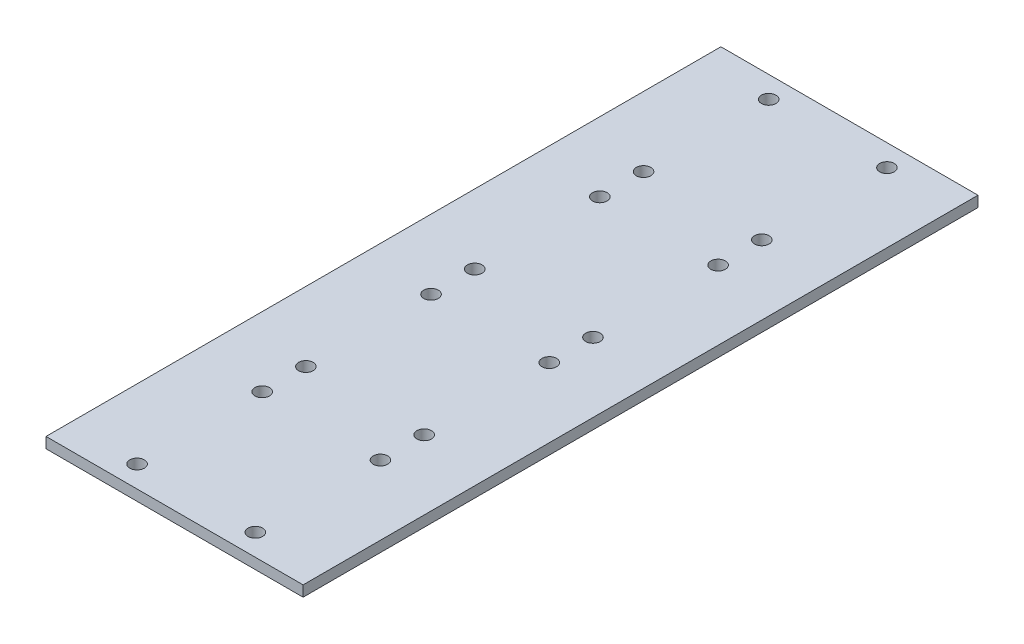
ISO-10303-21;
HEADER;
FILE_DESCRIPTION(('STEP AP214'),'2;1');
FILE_NAME('part.step','',(''),(''),'','','');
FILE_SCHEMA(('AUTOMOTIVE_DESIGN { 1 0 10303 214 1 1 1 1 }'));
ENDSEC;
DATA;
#1=APPLICATION_CONTEXT('core data for automotive mechanical design processes');
#2=APPLICATION_PROTOCOL_DEFINITION('international standard','automotive_design',2000,#1);
#3=PRODUCT_CONTEXT('',#1,'mechanical');
#4=PRODUCT('Part','Part','',(#3));
#5=PRODUCT_RELATED_PRODUCT_CATEGORY('part','',(#4));
#6=PRODUCT_DEFINITION_FORMATION('','',#4);
#7=PRODUCT_DEFINITION_CONTEXT('part definition',#1,'design');
#8=PRODUCT_DEFINITION('design','',#6,#7);
#9=PRODUCT_DEFINITION_SHAPE('','',#8);
#10=(LENGTH_UNIT() NAMED_UNIT(*) SI_UNIT(.MILLI.,.METRE.));
#11=(NAMED_UNIT(*) PLANE_ANGLE_UNIT() SI_UNIT($,.RADIAN.));
#12=(NAMED_UNIT(*) SI_UNIT($,.STERADIAN.) SOLID_ANGLE_UNIT());
#13=UNCERTAINTY_MEASURE_WITH_UNIT(LENGTH_MEASURE(1.E-05),#10,'distance_accuracy_value','');
#14=(GEOMETRIC_REPRESENTATION_CONTEXT(3) GLOBAL_UNCERTAINTY_ASSIGNED_CONTEXT((#13)) GLOBAL_UNIT_ASSIGNED_CONTEXT((#10,
#11,#12)) REPRESENTATION_CONTEXT('',''));
#15=CARTESIAN_POINT('',(0.,0.,0.));
#16=DIRECTION('',(0.,0.,1.));
#17=DIRECTION('',(1.,0.,0.));
#18=AXIS2_PLACEMENT_3D('',#15,#16,#17);
#19=CARTESIAN_POINT('',(0.,3.175,0.));
#20=DIRECTION('',(0.,1.,0.));
#21=DIRECTION('',(0.,0.,1.));
#22=AXIS2_PLACEMENT_3D('',#19,#20,#21);
#23=PLANE('',#22);
#24=CARTESIAN_POINT('',(0.,3.175,-113.03));
#25=DIRECTION('',(0.,1.,0.));
#26=DIRECTION('',(0.,0.,1.));
#27=AXIS2_PLACEMENT_3D('',#24,#25,#26);
#28=CIRCLE('',#27,2.159);
#29=CARTESIAN_POINT('',(0.,3.175,-110.871));
#30=VERTEX_POINT('',#29);
#31=EDGE_CURVE('E196',#30,#30,#28,.T.);
#32=ORIENTED_EDGE('',*,*,#31,.F.);
#33=EDGE_LOOP('',(#32));
#34=FACE_BOUND('',#33,.T.);
#35=CARTESIAN_POINT('',(0.,3.175,-150.114));
#36=DIRECTION('',(0.,1.,0.));
#37=DIRECTION('',(0.,0.,1.));
#38=AXIS2_PLACEMENT_3D('',#35,#36,#37);
#39=CIRCLE('',#38,2.15899999999999);
#40=CARTESIAN_POINT('',(0.,3.175,-147.955));
#41=VERTEX_POINT('',#40);
#42=EDGE_CURVE('E184',#41,#41,#39,.T.);
#43=ORIENTED_EDGE('',*,*,#42,.F.);
#44=EDGE_LOOP('',(#43));
#45=FACE_BOUND('',#44,.T.);
#46=CARTESIAN_POINT('',(0.,3.175,-62.992));
#47=DIRECTION('',(0.,1.,0.));
#48=DIRECTION('',(0.,0.,1.));
#49=AXIS2_PLACEMENT_3D('',#46,#47,#48);
#50=CIRCLE('',#49,2.159);
#51=CARTESIAN_POINT('',(0.,3.175,-60.833));
#52=VERTEX_POINT('',#51);
#53=EDGE_CURVE('E172',#52,#52,#50,.T.);
#54=ORIENTED_EDGE('',*,*,#53,.F.);
#55=EDGE_LOOP('',(#54));
#56=FACE_BOUND('',#55,.T.);
#57=CARTESIAN_POINT('',(0.,3.175,-100.076));
#58=DIRECTION('',(0.,1.,0.));
#59=DIRECTION('',(0.,0.,1.));
#60=AXIS2_PLACEMENT_3D('',#57,#58,#59);
#61=CIRCLE('',#60,2.159);
#62=CARTESIAN_POINT('',(0.,3.175,-97.917));
#63=VERTEX_POINT('',#62);
#64=EDGE_CURVE('E160',#63,#63,#61,.T.);
#65=ORIENTED_EDGE('',*,*,#64,.F.);
#66=EDGE_LOOP('',(#65));
#67=FACE_BOUND('',#66,.T.);
#68=CARTESIAN_POINT('',(0.,3.175,-12.954));
#69=DIRECTION('',(0.,1.,0.));
#70=DIRECTION('',(0.,0.,1.));
#71=AXIS2_PLACEMENT_3D('',#68,#69,#70);
#72=CIRCLE('',#71,2.15899999999992);
#73=CARTESIAN_POINT('',(0.,3.175,-10.7950000000001));
#74=VERTEX_POINT('',#73);
#75=EDGE_CURVE('E148',#74,#74,#72,.T.);
#76=ORIENTED_EDGE('',*,*,#75,.F.);
#77=EDGE_LOOP('',(#76));
#78=FACE_BOUND('',#77,.T.);
#79=CARTESIAN_POINT('',(0.,3.175,-50.038));
#80=DIRECTION('',(0.,1.,0.));
#81=DIRECTION('',(0.,0.,1.));
#82=AXIS2_PLACEMENT_3D('',#79,#80,#81);
#83=CIRCLE('',#82,2.159);
#84=CARTESIAN_POINT('',(0.,3.175,-47.879));
#85=VERTEX_POINT('',#84);
#86=EDGE_CURVE('E136',#85,#85,#83,.T.);
#87=ORIENTED_EDGE('',*,*,#86,.F.);
#88=EDGE_LOOP('',(#87));
#89=FACE_BOUND('',#88,.T.);
#90=CARTESIAN_POINT('',(0.,3.175,37.084));
#91=DIRECTION('',(0.,1.,0.));
#92=DIRECTION('',(0.,0.,1.));
#93=AXIS2_PLACEMENT_3D('',#90,#91,#92);
#94=CIRCLE('',#93,2.159);
#95=CARTESIAN_POINT('',(0.,3.175,39.243));
#96=VERTEX_POINT('',#95);
#97=EDGE_CURVE('E124',#96,#96,#94,.T.);
#98=ORIENTED_EDGE('',*,*,#97,.F.);
#99=EDGE_LOOP('',(#98));
#100=FACE_BOUND('',#99,.T.);
#101=CARTESIAN_POINT('',(0.,3.175,0.));
#102=DIRECTION('',(0.,1.,0.));
#103=DIRECTION('',(0.,0.,1.));
#104=AXIS2_PLACEMENT_3D('',#101,#102,#103);
#105=CIRCLE('',#104,2.159);
#106=CARTESIAN_POINT('',(0.,3.175,2.159));
#107=VERTEX_POINT('',#106);
#108=EDGE_CURVE('E103',#107,#107,#105,.T.);
#109=ORIENTED_EDGE('',*,*,#108,.F.);
#110=EDGE_LOOP('',(#109));
#111=FACE_BOUND('',#110,.T.);
#112=DIRECTION('',(0.,0.,1.));
#113=VECTOR('',#112,1.);
#114=CARTESIAN_POINT('',(-20.574,3.175,-156.5275));
#115=LINE('',#114,#113);
#116=CARTESIAN_POINT('',(-20.574,3.175,-156.5275));
#117=VERTEX_POINT('',#116);
#118=CARTESIAN_POINT('',(-20.574,3.175,43.4975));
#119=VERTEX_POINT('',#118);
#120=EDGE_CURVE('E88',#117,#119,#115,.T.);
#121=ORIENTED_EDGE('',*,*,#120,.T.);
#122=DIRECTION('',(1.,0.,0.));
#123=VECTOR('',#122,1.);
#124=CARTESIAN_POINT('',(-20.574,3.175,43.4975));
#125=LINE('',#124,#123);
#126=CARTESIAN_POINT('',(55.626,3.175,43.4975));
#127=VERTEX_POINT('',#126);
#128=EDGE_CURVE('E83',#119,#127,#125,.T.);
#129=ORIENTED_EDGE('',*,*,#128,.T.);
#130=DIRECTION('',(0.,0.,-1.));
#131=VECTOR('',#130,1.);
#132=CARTESIAN_POINT('',(55.626,3.175,-156.5275));
#133=LINE('',#132,#131);
#134=CARTESIAN_POINT('',(55.626,3.175,-156.5275));
#135=VERTEX_POINT('',#134);
#136=EDGE_CURVE('E86',#127,#135,#133,.T.);
#137=ORIENTED_EDGE('',*,*,#136,.T.);
#138=DIRECTION('',(-1.,0.,0.));
#139=VECTOR('',#138,1.);
#140=CARTESIAN_POINT('',(-20.574,3.175,-156.5275));
#141=LINE('',#140,#139);
#142=EDGE_CURVE('E53',#135,#117,#141,.T.);
#143=ORIENTED_EDGE('',*,*,#142,.T.);
#144=EDGE_LOOP('',(#121,#129,#137,#143));
#145=FACE_BOUND('',#144,.T.);
#146=CARTESIAN_POINT('',(35.052,3.175,0.));
#147=DIRECTION('',(0.,1.,0.));
#148=DIRECTION('',(0.,0.,1.));
#149=AXIS2_PLACEMENT_3D('',#146,#147,#148);
#150=CIRCLE('',#149,2.159);
#151=CARTESIAN_POINT('',(35.052,3.175,2.159));
#152=VERTEX_POINT('',#151);
#153=EDGE_CURVE('E118',#152,#152,#150,.T.);
#154=ORIENTED_EDGE('',*,*,#153,.F.);
#155=EDGE_LOOP('',(#154));
#156=FACE_BOUND('',#155,.T.);
#157=CARTESIAN_POINT('',(35.052,3.175,37.084));
#158=DIRECTION('',(0.,1.,0.));
#159=DIRECTION('',(0.,0.,1.));
#160=AXIS2_PLACEMENT_3D('',#157,#158,#159);
#161=CIRCLE('',#160,2.159);
#162=CARTESIAN_POINT('',(35.052,3.175,39.243));
#163=VERTEX_POINT('',#162);
#164=EDGE_CURVE('E130',#163,#163,#161,.T.);
#165=ORIENTED_EDGE('',*,*,#164,.F.);
#166=EDGE_LOOP('',(#165));
#167=FACE_BOUND('',#166,.T.);
#168=CARTESIAN_POINT('',(35.052,3.175,-50.038));
#169=DIRECTION('',(0.,1.,0.));
#170=DIRECTION('',(0.,0.,1.));
#171=AXIS2_PLACEMENT_3D('',#168,#169,#170);
#172=CIRCLE('',#171,2.159);
#173=CARTESIAN_POINT('',(35.052,3.175,-47.879));
#174=VERTEX_POINT('',#173);
#175=EDGE_CURVE('E142',#174,#174,#172,.T.);
#176=ORIENTED_EDGE('',*,*,#175,.F.);
#177=EDGE_LOOP('',(#176));
#178=FACE_BOUND('',#177,.T.);
#179=CARTESIAN_POINT('',(35.052,3.175,-12.954));
#180=DIRECTION('',(0.,1.,0.));
#181=DIRECTION('',(0.,0.,1.));
#182=AXIS2_PLACEMENT_3D('',#179,#180,#181);
#183=CIRCLE('',#182,2.15899999999998);
#184=CARTESIAN_POINT('',(35.052,3.175,-10.795));
#185=VERTEX_POINT('',#184);
#186=EDGE_CURVE('E154',#185,#185,#183,.T.);
#187=ORIENTED_EDGE('',*,*,#186,.F.);
#188=EDGE_LOOP('',(#187));
#189=FACE_BOUND('',#188,.T.);
#190=CARTESIAN_POINT('',(35.052,3.175,-100.076));
#191=DIRECTION('',(0.,1.,0.));
#192=DIRECTION('',(0.,0.,1.));
#193=AXIS2_PLACEMENT_3D('',#190,#191,#192);
#194=CIRCLE('',#193,2.15900000000001);
#195=CARTESIAN_POINT('',(35.052,3.175,-97.917));
#196=VERTEX_POINT('',#195);
#197=EDGE_CURVE('E166',#196,#196,#194,.T.);
#198=ORIENTED_EDGE('',*,*,#197,.F.);
#199=EDGE_LOOP('',(#198));
#200=FACE_BOUND('',#199,.T.);
#201=CARTESIAN_POINT('',(35.052,3.175,-62.992));
#202=DIRECTION('',(0.,1.,0.));
#203=DIRECTION('',(0.,0.,1.));
#204=AXIS2_PLACEMENT_3D('',#201,#202,#203);
#205=CIRCLE('',#204,2.15900000000001);
#206=CARTESIAN_POINT('',(35.052,3.175,-60.833));
#207=VERTEX_POINT('',#206);
#208=EDGE_CURVE('E178',#207,#207,#205,.T.);
#209=ORIENTED_EDGE('',*,*,#208,.F.);
#210=EDGE_LOOP('',(#209));
#211=FACE_BOUND('',#210,.T.);
#212=CARTESIAN_POINT('',(35.052,3.175,-150.114));
#213=DIRECTION('',(0.,1.,0.));
#214=DIRECTION('',(0.,0.,1.));
#215=AXIS2_PLACEMENT_3D('',#212,#213,#214);
#216=CIRCLE('',#215,2.15899999999998);
#217=CARTESIAN_POINT('',(35.052,3.175,-147.955));
#218=VERTEX_POINT('',#217);
#219=EDGE_CURVE('E190',#218,#218,#216,.T.);
#220=ORIENTED_EDGE('',*,*,#219,.F.);
#221=EDGE_LOOP('',(#220));
#222=FACE_BOUND('',#221,.T.);
#223=CARTESIAN_POINT('',(35.052,3.175,-113.03));
#224=DIRECTION('',(0.,1.,0.));
#225=DIRECTION('',(0.,0.,1.));
#226=AXIS2_PLACEMENT_3D('',#223,#224,#225);
#227=CIRCLE('',#226,2.15899999999999);
#228=CARTESIAN_POINT('',(35.052,3.175,-110.871));
#229=VERTEX_POINT('',#228);
#230=EDGE_CURVE('E202',#229,#229,#227,.T.);
#231=ORIENTED_EDGE('',*,*,#230,.F.);
#232=EDGE_LOOP('',(#231));
#233=FACE_BOUND('',#232,.T.);
#234=ADVANCED_FACE('F36',(#34,#45,#56,#67,#78,#89,#100,#111,#145,#156,#167,#178,#189,#200,#211,
#222,#233),#23,.T.);
#235=CARTESIAN_POINT('',(0.,0.,0.));
#236=DIRECTION('',(0.,1.,0.));
#237=DIRECTION('',(0.,0.,1.));
#238=AXIS2_PLACEMENT_3D('',#235,#236,#237);
#239=PLANE('',#238);
#240=DIRECTION('',(0.,0.,1.));
#241=VECTOR('',#240,1.);
#242=CARTESIAN_POINT('',(-20.574,0.,-156.5275));
#243=LINE('',#242,#241);
#244=CARTESIAN_POINT('',(-20.574,0.,-156.5275));
#245=VERTEX_POINT('',#244);
#246=CARTESIAN_POINT('',(-20.574,0.,43.4975));
#247=VERTEX_POINT('',#246);
#248=EDGE_CURVE('E100',#245,#247,#243,.T.);
#249=ORIENTED_EDGE('',*,*,#248,.F.);
#250=DIRECTION('',(-1.,0.,0.));
#251=VECTOR('',#250,1.);
#252=CARTESIAN_POINT('',(-20.574,0.,-156.5275));
#253=LINE('',#252,#251);
#254=CARTESIAN_POINT('',(55.626,0.,-156.5275));
#255=VERTEX_POINT('',#254);
#256=EDGE_CURVE('E76',#255,#245,#253,.T.);
#257=ORIENTED_EDGE('',*,*,#256,.F.);
#258=DIRECTION('',(0.,0.,-1.));
#259=VECTOR('',#258,1.);
#260=CARTESIAN_POINT('',(55.626,0.,-156.5275));
#261=LINE('',#260,#259);
#262=CARTESIAN_POINT('',(55.626,0.,43.4975));
#263=VERTEX_POINT('',#262);
#264=EDGE_CURVE('E70',#263,#255,#261,.T.);
#265=ORIENTED_EDGE('',*,*,#264,.F.);
#266=DIRECTION('',(1.,0.,0.));
#267=VECTOR('',#266,1.);
#268=CARTESIAN_POINT('',(-20.574,0.,43.4975));
#269=LINE('',#268,#267);
#270=EDGE_CURVE('E92',#247,#263,#269,.T.);
#271=ORIENTED_EDGE('',*,*,#270,.F.);
#272=EDGE_LOOP('',(#249,#257,#265,#271));
#273=FACE_BOUND('',#272,.T.);
#274=CARTESIAN_POINT('',(0.,0.,0.));
#275=DIRECTION('',(0.,1.,0.));
#276=DIRECTION('',(0.,0.,1.));
#277=AXIS2_PLACEMENT_3D('',#274,#275,#276);
#278=CIRCLE('',#277,2.159);
#279=CARTESIAN_POINT('',(0.,0.,2.159));
#280=VERTEX_POINT('',#279);
#281=EDGE_CURVE('E115',#280,#280,#278,.T.);
#282=ORIENTED_EDGE('',*,*,#281,.T.);
#283=EDGE_LOOP('',(#282));
#284=FACE_BOUND('',#283,.T.);
#285=CARTESIAN_POINT('',(35.052,0.,0.));
#286=DIRECTION('',(0.,1.,0.));
#287=DIRECTION('',(0.,0.,1.));
#288=AXIS2_PLACEMENT_3D('',#285,#286,#287);
#289=CIRCLE('',#288,2.159);
#290=CARTESIAN_POINT('',(35.052,0.,2.159));
#291=VERTEX_POINT('',#290);
#292=EDGE_CURVE('E121',#291,#291,#289,.T.);
#293=ORIENTED_EDGE('',*,*,#292,.T.);
#294=EDGE_LOOP('',(#293));
#295=FACE_BOUND('',#294,.T.);
#296=CARTESIAN_POINT('',(0.,0.,37.084));
#297=DIRECTION('',(0.,1.,0.));
#298=DIRECTION('',(0.,0.,1.));
#299=AXIS2_PLACEMENT_3D('',#296,#297,#298);
#300=CIRCLE('',#299,2.159);
#301=CARTESIAN_POINT('',(0.,0.,39.243));
#302=VERTEX_POINT('',#301);
#303=EDGE_CURVE('E127',#302,#302,#300,.T.);
#304=ORIENTED_EDGE('',*,*,#303,.T.);
#305=EDGE_LOOP('',(#304));
#306=FACE_BOUND('',#305,.T.);
#307=CARTESIAN_POINT('',(35.052,0.,37.084));
#308=DIRECTION('',(0.,1.,0.));
#309=DIRECTION('',(0.,0.,1.));
#310=AXIS2_PLACEMENT_3D('',#307,#308,#309);
#311=CIRCLE('',#310,2.159);
#312=CARTESIAN_POINT('',(35.052,0.,39.243));
#313=VERTEX_POINT('',#312);
#314=EDGE_CURVE('E133',#313,#313,#311,.T.);
#315=ORIENTED_EDGE('',*,*,#314,.T.);
#316=EDGE_LOOP('',(#315));
#317=FACE_BOUND('',#316,.T.);
#318=CARTESIAN_POINT('',(0.,0.,-50.038));
#319=DIRECTION('',(0.,1.,0.));
#320=DIRECTION('',(0.,0.,1.));
#321=AXIS2_PLACEMENT_3D('',#318,#319,#320);
#322=CIRCLE('',#321,2.159);
#323=CARTESIAN_POINT('',(0.,0.,-47.879));
#324=VERTEX_POINT('',#323);
#325=EDGE_CURVE('E139',#324,#324,#322,.T.);
#326=ORIENTED_EDGE('',*,*,#325,.T.);
#327=EDGE_LOOP('',(#326));
#328=FACE_BOUND('',#327,.T.);
#329=CARTESIAN_POINT('',(35.052,0.,-50.038));
#330=DIRECTION('',(0.,1.,0.));
#331=DIRECTION('',(0.,0.,1.));
#332=AXIS2_PLACEMENT_3D('',#329,#330,#331);
#333=CIRCLE('',#332,2.159);
#334=CARTESIAN_POINT('',(35.052,0.,-47.879));
#335=VERTEX_POINT('',#334);
#336=EDGE_CURVE('E145',#335,#335,#333,.T.);
#337=ORIENTED_EDGE('',*,*,#336,.T.);
#338=EDGE_LOOP('',(#337));
#339=FACE_BOUND('',#338,.T.);
#340=CARTESIAN_POINT('',(0.,0.,-12.954));
#341=DIRECTION('',(0.,1.,0.));
#342=DIRECTION('',(0.,0.,1.));
#343=AXIS2_PLACEMENT_3D('',#340,#341,#342);
#344=CIRCLE('',#343,2.15899999999992);
#345=CARTESIAN_POINT('',(0.,0.,-10.7950000000001));
#346=VERTEX_POINT('',#345);
#347=EDGE_CURVE('E151',#346,#346,#344,.T.);
#348=ORIENTED_EDGE('',*,*,#347,.T.);
#349=EDGE_LOOP('',(#348));
#350=FACE_BOUND('',#349,.T.);
#351=CARTESIAN_POINT('',(35.052,0.,-12.954));
#352=DIRECTION('',(0.,1.,0.));
#353=DIRECTION('',(0.,0.,1.));
#354=AXIS2_PLACEMENT_3D('',#351,#352,#353);
#355=CIRCLE('',#354,2.15899999999998);
#356=CARTESIAN_POINT('',(35.052,0.,-10.795));
#357=VERTEX_POINT('',#356);
#358=EDGE_CURVE('E157',#357,#357,#355,.T.);
#359=ORIENTED_EDGE('',*,*,#358,.T.);
#360=EDGE_LOOP('',(#359));
#361=FACE_BOUND('',#360,.T.);
#362=CARTESIAN_POINT('',(0.,0.,-100.076));
#363=DIRECTION('',(0.,1.,0.));
#364=DIRECTION('',(0.,0.,1.));
#365=AXIS2_PLACEMENT_3D('',#362,#363,#364);
#366=CIRCLE('',#365,2.159);
#367=CARTESIAN_POINT('',(0.,0.,-97.917));
#368=VERTEX_POINT('',#367);
#369=EDGE_CURVE('E163',#368,#368,#366,.T.);
#370=ORIENTED_EDGE('',*,*,#369,.T.);
#371=EDGE_LOOP('',(#370));
#372=FACE_BOUND('',#371,.T.);
#373=CARTESIAN_POINT('',(35.052,0.,-100.076));
#374=DIRECTION('',(0.,1.,0.));
#375=DIRECTION('',(0.,0.,1.));
#376=AXIS2_PLACEMENT_3D('',#373,#374,#375);
#377=CIRCLE('',#376,2.15900000000001);
#378=CARTESIAN_POINT('',(35.052,0.,-97.917));
#379=VERTEX_POINT('',#378);
#380=EDGE_CURVE('E169',#379,#379,#377,.T.);
#381=ORIENTED_EDGE('',*,*,#380,.T.);
#382=EDGE_LOOP('',(#381));
#383=FACE_BOUND('',#382,.T.);
#384=CARTESIAN_POINT('',(0.,0.,-62.992));
#385=DIRECTION('',(0.,1.,0.));
#386=DIRECTION('',(0.,0.,1.));
#387=AXIS2_PLACEMENT_3D('',#384,#385,#386);
#388=CIRCLE('',#387,2.159);
#389=CARTESIAN_POINT('',(0.,0.,-60.833));
#390=VERTEX_POINT('',#389);
#391=EDGE_CURVE('E175',#390,#390,#388,.T.);
#392=ORIENTED_EDGE('',*,*,#391,.T.);
#393=EDGE_LOOP('',(#392));
#394=FACE_BOUND('',#393,.T.);
#395=CARTESIAN_POINT('',(35.052,0.,-62.992));
#396=DIRECTION('',(0.,1.,0.));
#397=DIRECTION('',(0.,0.,1.));
#398=AXIS2_PLACEMENT_3D('',#395,#396,#397);
#399=CIRCLE('',#398,2.15900000000001);
#400=CARTESIAN_POINT('',(35.052,0.,-60.833));
#401=VERTEX_POINT('',#400);
#402=EDGE_CURVE('E181',#401,#401,#399,.T.);
#403=ORIENTED_EDGE('',*,*,#402,.T.);
#404=EDGE_LOOP('',(#403));
#405=FACE_BOUND('',#404,.T.);
#406=CARTESIAN_POINT('',(0.,0.,-150.114));
#407=DIRECTION('',(0.,1.,0.));
#408=DIRECTION('',(0.,0.,1.));
#409=AXIS2_PLACEMENT_3D('',#406,#407,#408);
#410=CIRCLE('',#409,2.15899999999999);
#411=CARTESIAN_POINT('',(0.,0.,-147.955));
#412=VERTEX_POINT('',#411);
#413=EDGE_CURVE('E187',#412,#412,#410,.T.);
#414=ORIENTED_EDGE('',*,*,#413,.T.);
#415=EDGE_LOOP('',(#414));
#416=FACE_BOUND('',#415,.T.);
#417=CARTESIAN_POINT('',(35.052,0.,-150.114));
#418=DIRECTION('',(0.,1.,0.));
#419=DIRECTION('',(0.,0.,1.));
#420=AXIS2_PLACEMENT_3D('',#417,#418,#419);
#421=CIRCLE('',#420,2.15899999999998);
#422=CARTESIAN_POINT('',(35.052,0.,-147.955));
#423=VERTEX_POINT('',#422);
#424=EDGE_CURVE('E193',#423,#423,#421,.T.);
#425=ORIENTED_EDGE('',*,*,#424,.T.);
#426=EDGE_LOOP('',(#425));
#427=FACE_BOUND('',#426,.T.);
#428=CARTESIAN_POINT('',(0.,0.,-113.03));
#429=DIRECTION('',(0.,1.,0.));
#430=DIRECTION('',(0.,0.,1.));
#431=AXIS2_PLACEMENT_3D('',#428,#429,#430);
#432=CIRCLE('',#431,2.159);
#433=CARTESIAN_POINT('',(0.,0.,-110.871));
#434=VERTEX_POINT('',#433);
#435=EDGE_CURVE('E199',#434,#434,#432,.T.);
#436=ORIENTED_EDGE('',*,*,#435,.T.);
#437=EDGE_LOOP('',(#436));
#438=FACE_BOUND('',#437,.T.);
#439=CARTESIAN_POINT('',(35.052,0.,-113.03));
#440=DIRECTION('',(0.,1.,0.));
#441=DIRECTION('',(0.,0.,1.));
#442=AXIS2_PLACEMENT_3D('',#439,#440,#441);
#443=CIRCLE('',#442,2.15899999999999);
#444=CARTESIAN_POINT('',(35.052,0.,-110.871));
#445=VERTEX_POINT('',#444);
#446=EDGE_CURVE('E205',#445,#445,#443,.T.);
#447=ORIENTED_EDGE('',*,*,#446,.T.);
#448=EDGE_LOOP('',(#447));
#449=FACE_BOUND('',#448,.T.);
#450=ADVANCED_FACE('F111',(#273,#284,#295,#306,#317,#328,#339,#350,#361,#372,#383,#394,#405,
#416,#427,#438,#449),#239,.F.);
#451=CARTESIAN_POINT('',(-20.574,3.175,-156.5275));
#452=DIRECTION('',(1.,0.,0.));
#453=DIRECTION('',(0.,0.,-1.));
#454=AXIS2_PLACEMENT_3D('',#451,#452,#453);
#455=PLANE('',#454);
#456=ORIENTED_EDGE('',*,*,#248,.T.);
#457=DIRECTION('',(0.,-1.,0.));
#458=VECTOR('',#457,1.);
#459=CARTESIAN_POINT('',(-20.574,3.175,43.4975));
#460=LINE('',#459,#458);
#461=EDGE_CURVE('E11',#119,#247,#460,.T.);
#462=ORIENTED_EDGE('',*,*,#461,.F.);
#463=ORIENTED_EDGE('',*,*,#120,.F.);
#464=DIRECTION('',(0.,-1.,0.));
#465=VECTOR('',#464,1.);
#466=CARTESIAN_POINT('',(-20.574,3.175,-156.5275));
#467=LINE('',#466,#465);
#468=EDGE_CURVE('E96',#117,#245,#467,.T.);
#469=ORIENTED_EDGE('',*,*,#468,.T.);
#470=EDGE_LOOP('',(#456,#462,#463,#469));
#471=FACE_BOUND('',#470,.T.);
#472=ADVANCED_FACE('F38',(#471),#455,.F.);
#473=CARTESIAN_POINT('',(-20.574,3.175,43.4975));
#474=DIRECTION('',(0.,0.,-1.));
#475=DIRECTION('',(-1.,0.,0.));
#476=AXIS2_PLACEMENT_3D('',#473,#474,#475);
#477=PLANE('',#476);
#478=ORIENTED_EDGE('',*,*,#270,.T.);
#479=DIRECTION('',(0.,-1.,0.));
#480=VECTOR('',#479,1.);
#481=CARTESIAN_POINT('',(55.626,3.175,43.4975));
#482=LINE('',#481,#480);
#483=EDGE_CURVE('E45',#127,#263,#482,.T.);
#484=ORIENTED_EDGE('',*,*,#483,.F.);
#485=ORIENTED_EDGE('',*,*,#128,.F.);
#486=ORIENTED_EDGE('',*,*,#461,.T.);
#487=EDGE_LOOP('',(#478,#484,#485,#486));
#488=FACE_BOUND('',#487,.T.);
#489=ADVANCED_FACE('F91',(#488),#477,.F.);
#490=CARTESIAN_POINT('',(55.626,3.175,-156.5275));
#491=DIRECTION('',(-1.,0.,0.));
#492=DIRECTION('',(0.,0.,1.));
#493=AXIS2_PLACEMENT_3D('',#490,#491,#492);
#494=PLANE('',#493);
#495=ORIENTED_EDGE('',*,*,#264,.T.);
#496=DIRECTION('',(0.,-1.,0.));
#497=VECTOR('',#496,1.);
#498=CARTESIAN_POINT('',(55.626,3.175,-156.5275));
#499=LINE('',#498,#497);
#500=EDGE_CURVE('E93',#135,#255,#499,.T.);
#501=ORIENTED_EDGE('',*,*,#500,.F.);
#502=ORIENTED_EDGE('',*,*,#136,.F.);
#503=ORIENTED_EDGE('',*,*,#483,.T.);
#504=EDGE_LOOP('',(#495,#501,#502,#503));
#505=FACE_BOUND('',#504,.T.);
#506=ADVANCED_FACE('F94',(#505),#494,.F.);
#507=CARTESIAN_POINT('',(-20.574,3.175,-156.5275));
#508=DIRECTION('',(0.,0.,1.));
#509=DIRECTION('',(1.,0.,0.));
#510=AXIS2_PLACEMENT_3D('',#507,#508,#509);
#511=PLANE('',#510);
#512=ORIENTED_EDGE('',*,*,#256,.T.);
#513=ORIENTED_EDGE('',*,*,#468,.F.);
#514=ORIENTED_EDGE('',*,*,#142,.F.);
#515=ORIENTED_EDGE('',*,*,#500,.T.);
#516=EDGE_LOOP('',(#512,#513,#514,#515));
#517=FACE_BOUND('',#516,.T.);
#518=ADVANCED_FACE('F108',(#517),#511,.F.);
#519=CARTESIAN_POINT('',(0.,3.175,0.));
#520=DIRECTION('',(0.,-1.,0.));
#521=DIRECTION('',(0.,0.,-1.));
#522=AXIS2_PLACEMENT_3D('',#519,#520,#521);
#523=CYLINDRICAL_SURFACE('',#522,2.159);
#524=ORIENTED_EDGE('',*,*,#108,.T.);
#525=EDGE_LOOP('',(#524));
#526=FACE_BOUND('',#525,.T.);
#527=ORIENTED_EDGE('',*,*,#281,.F.);
#528=EDGE_LOOP('',(#527));
#529=FACE_BOUND('',#528,.T.);
#530=ADVANCED_FACE('F224',(#526,#529),#523,.F.);
#531=CARTESIAN_POINT('',(35.052,3.175,0.));
#532=DIRECTION('',(0.,-1.,0.));
#533=DIRECTION('',(0.,0.,-1.));
#534=AXIS2_PLACEMENT_3D('',#531,#532,#533);
#535=CYLINDRICAL_SURFACE('',#534,2.159);
#536=ORIENTED_EDGE('',*,*,#153,.T.);
#537=EDGE_LOOP('',(#536));
#538=FACE_BOUND('',#537,.T.);
#539=ORIENTED_EDGE('',*,*,#292,.F.);
#540=EDGE_LOOP('',(#539));
#541=FACE_BOUND('',#540,.T.);
#542=ADVANCED_FACE('F278',(#538,#541),#535,.F.);
#543=CARTESIAN_POINT('',(0.,3.175,37.084));
#544=DIRECTION('',(0.,-1.,0.));
#545=DIRECTION('',(0.,0.,-1.));
#546=AXIS2_PLACEMENT_3D('',#543,#544,#545);
#547=CYLINDRICAL_SURFACE('',#546,2.159);
#548=ORIENTED_EDGE('',*,*,#97,.T.);
#549=EDGE_LOOP('',(#548));
#550=FACE_BOUND('',#549,.T.);
#551=ORIENTED_EDGE('',*,*,#303,.F.);
#552=EDGE_LOOP('',(#551));
#553=FACE_BOUND('',#552,.T.);
#554=ADVANCED_FACE('F287',(#550,#553),#547,.F.);
#555=CARTESIAN_POINT('',(35.052,3.175,37.084));
#556=DIRECTION('',(0.,-1.,0.));
#557=DIRECTION('',(0.,0.,-1.));
#558=AXIS2_PLACEMENT_3D('',#555,#556,#557);
#559=CYLINDRICAL_SURFACE('',#558,2.159);
#560=ORIENTED_EDGE('',*,*,#164,.T.);
#561=EDGE_LOOP('',(#560));
#562=FACE_BOUND('',#561,.T.);
#563=ORIENTED_EDGE('',*,*,#314,.F.);
#564=EDGE_LOOP('',(#563));
#565=FACE_BOUND('',#564,.T.);
#566=ADVANCED_FACE('F296',(#562,#565),#559,.F.);
#567=CARTESIAN_POINT('',(0.,3.175,-50.038));
#568=DIRECTION('',(0.,-1.,0.));
#569=DIRECTION('',(0.,0.,-1.));
#570=AXIS2_PLACEMENT_3D('',#567,#568,#569);
#571=CYLINDRICAL_SURFACE('',#570,2.159);
#572=ORIENTED_EDGE('',*,*,#86,.T.);
#573=EDGE_LOOP('',(#572));
#574=FACE_BOUND('',#573,.T.);
#575=ORIENTED_EDGE('',*,*,#325,.F.);
#576=EDGE_LOOP('',(#575));
#577=FACE_BOUND('',#576,.T.);
#578=ADVANCED_FACE('F306',(#574,#577),#571,.F.);
#579=CARTESIAN_POINT('',(35.052,3.175,-50.038));
#580=DIRECTION('',(0.,-1.,0.));
#581=DIRECTION('',(0.,0.,-1.));
#582=AXIS2_PLACEMENT_3D('',#579,#580,#581);
#583=CYLINDRICAL_SURFACE('',#582,2.159);
#584=ORIENTED_EDGE('',*,*,#175,.T.);
#585=EDGE_LOOP('',(#584));
#586=FACE_BOUND('',#585,.T.);
#587=ORIENTED_EDGE('',*,*,#336,.F.);
#588=EDGE_LOOP('',(#587));
#589=FACE_BOUND('',#588,.T.);
#590=ADVANCED_FACE('F316',(#586,#589),#583,.F.);
#591=CARTESIAN_POINT('',(0.,3.175,-12.954));
#592=DIRECTION('',(0.,-1.,0.));
#593=DIRECTION('',(0.,0.,-1.));
#594=AXIS2_PLACEMENT_3D('',#591,#592,#593);
#595=CYLINDRICAL_SURFACE('',#594,2.15899999999992);
#596=ORIENTED_EDGE('',*,*,#75,.T.);
#597=EDGE_LOOP('',(#596));
#598=FACE_BOUND('',#597,.T.);
#599=ORIENTED_EDGE('',*,*,#347,.F.);
#600=EDGE_LOOP('',(#599));
#601=FACE_BOUND('',#600,.T.);
#602=ADVANCED_FACE('F326',(#598,#601),#595,.F.);
#603=CARTESIAN_POINT('',(35.052,3.175,-12.954));
#604=DIRECTION('',(0.,-1.,0.));
#605=DIRECTION('',(0.,0.,-1.));
#606=AXIS2_PLACEMENT_3D('',#603,#604,#605);
#607=CYLINDRICAL_SURFACE('',#606,2.15899999999998);
#608=ORIENTED_EDGE('',*,*,#186,.T.);
#609=EDGE_LOOP('',(#608));
#610=FACE_BOUND('',#609,.T.);
#611=ORIENTED_EDGE('',*,*,#358,.F.);
#612=EDGE_LOOP('',(#611));
#613=FACE_BOUND('',#612,.T.);
#614=ADVANCED_FACE('F336',(#610,#613),#607,.F.);
#615=CARTESIAN_POINT('',(0.,3.175,-100.076));
#616=DIRECTION('',(0.,-1.,0.));
#617=DIRECTION('',(0.,0.,-1.));
#618=AXIS2_PLACEMENT_3D('',#615,#616,#617);
#619=CYLINDRICAL_SURFACE('',#618,2.159);
#620=ORIENTED_EDGE('',*,*,#64,.T.);
#621=EDGE_LOOP('',(#620));
#622=FACE_BOUND('',#621,.T.);
#623=ORIENTED_EDGE('',*,*,#369,.F.);
#624=EDGE_LOOP('',(#623));
#625=FACE_BOUND('',#624,.T.);
#626=ADVANCED_FACE('F346',(#622,#625),#619,.F.);
#627=CARTESIAN_POINT('',(35.052,3.175,-100.076));
#628=DIRECTION('',(0.,-1.,0.));
#629=DIRECTION('',(0.,0.,-1.));
#630=AXIS2_PLACEMENT_3D('',#627,#628,#629);
#631=CYLINDRICAL_SURFACE('',#630,2.15900000000001);
#632=ORIENTED_EDGE('',*,*,#197,.T.);
#633=EDGE_LOOP('',(#632));
#634=FACE_BOUND('',#633,.T.);
#635=ORIENTED_EDGE('',*,*,#380,.F.);
#636=EDGE_LOOP('',(#635));
#637=FACE_BOUND('',#636,.T.);
#638=ADVANCED_FACE('F356',(#634,#637),#631,.F.);
#639=CARTESIAN_POINT('',(0.,3.175,-62.992));
#640=DIRECTION('',(0.,-1.,0.));
#641=DIRECTION('',(0.,0.,-1.));
#642=AXIS2_PLACEMENT_3D('',#639,#640,#641);
#643=CYLINDRICAL_SURFACE('',#642,2.159);
#644=ORIENTED_EDGE('',*,*,#53,.T.);
#645=EDGE_LOOP('',(#644));
#646=FACE_BOUND('',#645,.T.);
#647=ORIENTED_EDGE('',*,*,#391,.F.);
#648=EDGE_LOOP('',(#647));
#649=FACE_BOUND('',#648,.T.);
#650=ADVANCED_FACE('F366',(#646,#649),#643,.F.);
#651=CARTESIAN_POINT('',(35.052,3.175,-62.992));
#652=DIRECTION('',(0.,-1.,0.));
#653=DIRECTION('',(0.,0.,-1.));
#654=AXIS2_PLACEMENT_3D('',#651,#652,#653);
#655=CYLINDRICAL_SURFACE('',#654,2.15900000000001);
#656=ORIENTED_EDGE('',*,*,#208,.T.);
#657=EDGE_LOOP('',(#656));
#658=FACE_BOUND('',#657,.T.);
#659=ORIENTED_EDGE('',*,*,#402,.F.);
#660=EDGE_LOOP('',(#659));
#661=FACE_BOUND('',#660,.T.);
#662=ADVANCED_FACE('F376',(#658,#661),#655,.F.);
#663=CARTESIAN_POINT('',(0.,3.175,-150.114));
#664=DIRECTION('',(0.,-1.,0.));
#665=DIRECTION('',(0.,0.,-1.));
#666=AXIS2_PLACEMENT_3D('',#663,#664,#665);
#667=CYLINDRICAL_SURFACE('',#666,2.15899999999999);
#668=ORIENTED_EDGE('',*,*,#42,.T.);
#669=EDGE_LOOP('',(#668));
#670=FACE_BOUND('',#669,.T.);
#671=ORIENTED_EDGE('',*,*,#413,.F.);
#672=EDGE_LOOP('',(#671));
#673=FACE_BOUND('',#672,.T.);
#674=ADVANCED_FACE('F386',(#670,#673),#667,.F.);
#675=CARTESIAN_POINT('',(35.052,3.175,-150.114));
#676=DIRECTION('',(0.,-1.,0.));
#677=DIRECTION('',(0.,0.,-1.));
#678=AXIS2_PLACEMENT_3D('',#675,#676,#677);
#679=CYLINDRICAL_SURFACE('',#678,2.15899999999998);
#680=ORIENTED_EDGE('',*,*,#219,.T.);
#681=EDGE_LOOP('',(#680));
#682=FACE_BOUND('',#681,.T.);
#683=ORIENTED_EDGE('',*,*,#424,.F.);
#684=EDGE_LOOP('',(#683));
#685=FACE_BOUND('',#684,.T.);
#686=ADVANCED_FACE('F396',(#682,#685),#679,.F.);
#687=CARTESIAN_POINT('',(0.,3.175,-113.03));
#688=DIRECTION('',(0.,-1.,0.));
#689=DIRECTION('',(0.,0.,-1.));
#690=AXIS2_PLACEMENT_3D('',#687,#688,#689);
#691=CYLINDRICAL_SURFACE('',#690,2.159);
#692=ORIENTED_EDGE('',*,*,#31,.T.);
#693=EDGE_LOOP('',(#692));
#694=FACE_BOUND('',#693,.T.);
#695=ORIENTED_EDGE('',*,*,#435,.F.);
#696=EDGE_LOOP('',(#695));
#697=FACE_BOUND('',#696,.T.);
#698=ADVANCED_FACE('F406',(#694,#697),#691,.F.);
#699=CARTESIAN_POINT('',(35.052,3.175,-113.03));
#700=DIRECTION('',(0.,-1.,0.));
#701=DIRECTION('',(0.,0.,-1.));
#702=AXIS2_PLACEMENT_3D('',#699,#700,#701);
#703=CYLINDRICAL_SURFACE('',#702,2.15899999999999);
#704=ORIENTED_EDGE('',*,*,#230,.T.);
#705=EDGE_LOOP('',(#704));
#706=FACE_BOUND('',#705,.T.);
#707=ORIENTED_EDGE('',*,*,#446,.F.);
#708=EDGE_LOOP('',(#707));
#709=FACE_BOUND('',#708,.T.);
#710=ADVANCED_FACE('F211',(#706,#709),#703,.F.);
#711=CLOSED_SHELL('',(#234,#450,#472,#489,#506,#518,#530,#542,#554,#566,#578,#590,#602,#614,
#626,#638,#650,#662,#674,#686,#698,#710));
#712=MANIFOLD_SOLID_BREP('B2',#711);
#713=ADVANCED_BREP_SHAPE_REPRESENTATION('',(#18,#712),#14);
#714=SHAPE_DEFINITION_REPRESENTATION(#9,#713);
ENDSEC;
END-ISO-10303-21;
